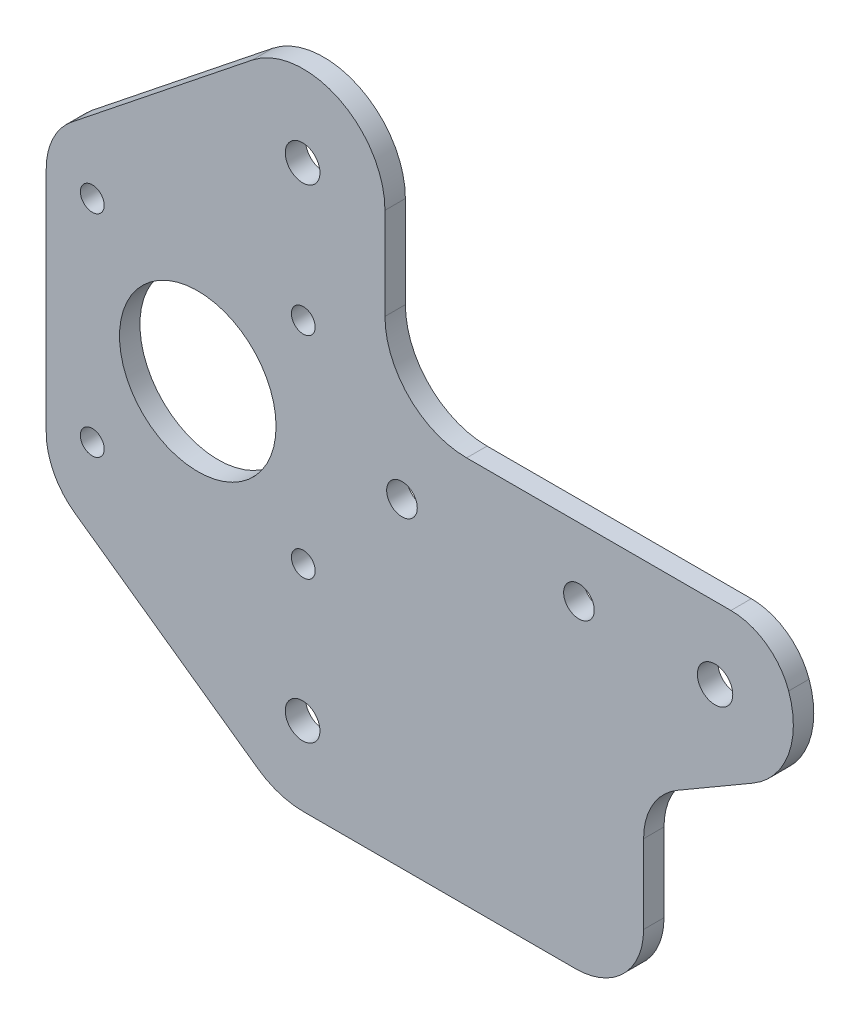
ISO-10303-21;
HEADER;
FILE_DESCRIPTION(('STEP AP214'),'2;1');
FILE_NAME('part.step','',(''),(''),'','','');
FILE_SCHEMA(('AUTOMOTIVE_DESIGN { 1 0 10303 214 1 1 1 1 }'));
ENDSEC;
DATA;
#1=APPLICATION_CONTEXT('core data for automotive mechanical design processes');
#2=APPLICATION_PROTOCOL_DEFINITION('international standard','automotive_design',2000,#1);
#3=PRODUCT_CONTEXT('',#1,'mechanical');
#4=PRODUCT('Part','Part','',(#3));
#5=PRODUCT_RELATED_PRODUCT_CATEGORY('part','',(#4));
#6=PRODUCT_DEFINITION_FORMATION('','',#4);
#7=PRODUCT_DEFINITION_CONTEXT('part definition',#1,'design');
#8=PRODUCT_DEFINITION('design','',#6,#7);
#9=PRODUCT_DEFINITION_SHAPE('','',#8);
#10=(LENGTH_UNIT() NAMED_UNIT(*) SI_UNIT(.MILLI.,.METRE.));
#11=(NAMED_UNIT(*) PLANE_ANGLE_UNIT() SI_UNIT($,.RADIAN.));
#12=(NAMED_UNIT(*) SI_UNIT($,.STERADIAN.) SOLID_ANGLE_UNIT());
#13=UNCERTAINTY_MEASURE_WITH_UNIT(LENGTH_MEASURE(1.E-05),#10,'distance_accuracy_value','');
#14=(GEOMETRIC_REPRESENTATION_CONTEXT(3) GLOBAL_UNCERTAINTY_ASSIGNED_CONTEXT((#13)) GLOBAL_UNIT_ASSIGNED_CONTEXT((#10,
#11,#12)) REPRESENTATION_CONTEXT('',''));
#15=CARTESIAN_POINT('',(0.,0.,0.));
#16=DIRECTION('',(0.,0.,1.));
#17=DIRECTION('',(1.,0.,0.));
#18=AXIS2_PLACEMENT_3D('',#15,#16,#17);
#19=CARTESIAN_POINT('',(78.328427124748,1.00000000000073,3.));
#20=DIRECTION('',(0.,0.,-1.));
#21=DIRECTION('',(-1.,0.,0.));
#22=AXIS2_PLACEMENT_3D('',#19,#20,#21);
#23=CYLINDRICAL_SURFACE('',#22,8.99999999999999);
#24=CARTESIAN_POINT('',(78.328427124748,1.00000000000073,0.));
#25=DIRECTION('',(0.,0.,-1.));
#26=DIRECTION('',(-1.,0.,0.));
#27=AXIS2_PLACEMENT_3D('',#24,#25,#26);
#28=CIRCLE('',#27,8.99999999999999);
#29=CARTESIAN_POINT('',(78.328427124748,10.0000000000007,0.));
#30=VERTEX_POINT('',#29);
#31=CARTESIAN_POINT('',(86.8137084989878,3.99999999999713,0.));
#32=VERTEX_POINT('',#31);
#33=EDGE_CURVE('E188',#30,#32,#28,.T.);
#34=ORIENTED_EDGE('',*,*,#33,.F.);
#35=DIRECTION('',(0.,0.,-1.));
#36=VECTOR('',#35,1.);
#37=CARTESIAN_POINT('',(78.328427124748,10.0000000000007,3.));
#38=LINE('',#37,#36);
#39=CARTESIAN_POINT('',(78.328427124748,10.0000000000007,3.));
#40=VERTEX_POINT('',#39);
#41=EDGE_CURVE('E11',#40,#30,#38,.T.);
#42=ORIENTED_EDGE('',*,*,#41,.F.);
#43=CARTESIAN_POINT('',(78.328427124748,1.00000000000073,3.));
#44=DIRECTION('',(0.,0.,-1.));
#45=DIRECTION('',(-1.,0.,0.));
#46=AXIS2_PLACEMENT_3D('',#43,#44,#45);
#47=CIRCLE('',#46,8.99999999999999);
#48=CARTESIAN_POINT('',(86.8137084989878,3.99999999999713,3.));
#49=VERTEX_POINT('',#48);
#50=EDGE_CURVE('E236',#40,#49,#47,.T.);
#51=ORIENTED_EDGE('',*,*,#50,.T.);
#52=DIRECTION('',(0.,0.,-1.));
#53=VECTOR('',#52,1.);
#54=CARTESIAN_POINT('',(86.8137084989878,3.99999999999713,3.));
#55=LINE('',#54,#53);
#56=EDGE_CURVE('E40',#49,#32,#55,.T.);
#57=ORIENTED_EDGE('',*,*,#56,.T.);
#58=EDGE_LOOP('',(#34,#42,#51,#57));
#59=FACE_BOUND('',#58,.T.);
#60=ADVANCED_FACE('F37',(#59),#23,.T.);
#61=CARTESIAN_POINT('',(39.499999999998,10.0000000000007,3.));
#62=DIRECTION('',(0.,1.,0.));
#63=DIRECTION('',(-1.,0.,0.));
#64=AXIS2_PLACEMENT_3D('',#61,#62,#63);
#65=PLANE('',#64);
#66=DIRECTION('',(1.,0.,0.));
#67=VECTOR('',#66,1.);
#68=CARTESIAN_POINT('',(39.499999999998,10.0000000000007,0.));
#69=LINE('',#68,#67);
#70=CARTESIAN_POINT('',(39.499999999998,10.0000000000007,0.));
#71=VERTEX_POINT('',#70);
#72=EDGE_CURVE('E234',#71,#30,#69,.T.);
#73=ORIENTED_EDGE('',*,*,#72,.F.);
#74=DIRECTION('',(0.,0.,-1.));
#75=VECTOR('',#74,1.);
#76=CARTESIAN_POINT('',(39.499999999998,10.0000000000007,3.));
#77=LINE('',#76,#75);
#78=CARTESIAN_POINT('',(39.499999999998,10.0000000000007,3.));
#79=VERTEX_POINT('',#78);
#80=EDGE_CURVE('E46',#79,#71,#77,.T.);
#81=ORIENTED_EDGE('',*,*,#80,.F.);
#82=DIRECTION('',(1.,0.,0.));
#83=VECTOR('',#82,1.);
#84=CARTESIAN_POINT('',(39.499999999998,10.0000000000007,3.));
#85=LINE('',#84,#83);
#86=EDGE_CURVE('E178',#79,#40,#85,.T.);
#87=ORIENTED_EDGE('',*,*,#86,.T.);
#88=ORIENTED_EDGE('',*,*,#41,.T.);
#89=EDGE_LOOP('',(#73,#81,#87,#88));
#90=FACE_BOUND('',#89,.T.);
#91=ADVANCED_FACE('F266',(#90),#65,.T.);
#92=CARTESIAN_POINT('',(39.499999999998,22.0000000000007,3.));
#93=DIRECTION('',(0.,0.,-1.));
#94=DIRECTION('',(-1.,0.,0.));
#95=AXIS2_PLACEMENT_3D('',#92,#93,#94);
#96=CYLINDRICAL_SURFACE('',#95,12.);
#97=CARTESIAN_POINT('',(39.499999999998,22.0000000000007,0.));
#98=DIRECTION('',(0.,0.,1.));
#99=DIRECTION('',(1.,0.,0.));
#100=AXIS2_PLACEMENT_3D('',#97,#98,#99);
#101=CIRCLE('',#100,12.);
#102=CARTESIAN_POINT('',(27.499999999998,22.0000000000007,0.));
#103=VERTEX_POINT('',#102);
#104=EDGE_CURVE('E165',#103,#71,#101,.T.);
#105=ORIENTED_EDGE('',*,*,#104,.F.);
#106=DIRECTION('',(0.,0.,-1.));
#107=VECTOR('',#106,1.);
#108=CARTESIAN_POINT('',(27.499999999998,22.0000000000007,3.));
#109=LINE('',#108,#107);
#110=CARTESIAN_POINT('',(27.499999999998,22.0000000000007,3.));
#111=VERTEX_POINT('',#110);
#112=EDGE_CURVE('E160',#111,#103,#109,.T.);
#113=ORIENTED_EDGE('',*,*,#112,.F.);
#114=CARTESIAN_POINT('',(39.499999999998,22.0000000000007,3.));
#115=DIRECTION('',(0.,0.,1.));
#116=DIRECTION('',(1.,0.,0.));
#117=AXIS2_PLACEMENT_3D('',#114,#115,#116);
#118=CIRCLE('',#117,12.);
#119=EDGE_CURVE('E163',#111,#79,#118,.T.);
#120=ORIENTED_EDGE('',*,*,#119,.T.);
#121=ORIENTED_EDGE('',*,*,#80,.T.);
#122=EDGE_LOOP('',(#105,#113,#120,#121));
#123=FACE_BOUND('',#122,.T.);
#124=ADVANCED_FACE('F162',(#123),#96,.F.);
#125=CARTESIAN_POINT('',(27.499999999998,35.5000000000007,3.));
#126=DIRECTION('',(1.,0.,0.));
#127=DIRECTION('',(0.,1.,0.));
#128=AXIS2_PLACEMENT_3D('',#125,#126,#127);
#129=PLANE('',#128);
#130=DIRECTION('',(0.,-1.,0.));
#131=VECTOR('',#130,1.);
#132=CARTESIAN_POINT('',(27.499999999998,35.5000000000007,0.));
#133=LINE('',#132,#131);
#134=CARTESIAN_POINT('',(27.4999999999991,35.5000000000007,0.));
#135=VERTEX_POINT('',#134);
#136=EDGE_CURVE('E231',#135,#103,#133,.T.);
#137=ORIENTED_EDGE('',*,*,#136,.F.);
#138=DIRECTION('',(0.,0.,-1.));
#139=VECTOR('',#138,1.);
#140=CARTESIAN_POINT('',(27.4999999999991,35.5000000000007,3.));
#141=LINE('',#140,#139);
#142=CARTESIAN_POINT('',(27.4999999999991,35.5000000000007,3.));
#143=VERTEX_POINT('',#142);
#144=EDGE_CURVE('E170',#143,#135,#141,.T.);
#145=ORIENTED_EDGE('',*,*,#144,.F.);
#146=DIRECTION('',(0.,-1.,0.));
#147=VECTOR('',#146,1.);
#148=CARTESIAN_POINT('',(27.499999999998,35.5000000000007,3.));
#149=LINE('',#148,#147);
#150=EDGE_CURVE('E176',#143,#111,#149,.T.);
#151=ORIENTED_EDGE('',*,*,#150,.T.);
#152=ORIENTED_EDGE('',*,*,#112,.T.);
#153=EDGE_LOOP('',(#137,#145,#151,#152));
#154=FACE_BOUND('',#153,.T.);
#155=ADVANCED_FACE('F180',(#154),#129,.T.);
#156=CARTESIAN_POINT('',(15.5,35.5,3.));
#157=DIRECTION('',(0.,0.,-1.));
#158=DIRECTION('',(-1.,0.,0.));
#159=AXIS2_PLACEMENT_3D('',#156,#157,#158);
#160=CYLINDRICAL_SURFACE('',#159,11.9999999999991);
#161=CARTESIAN_POINT('',(15.5,35.5,0.));
#162=DIRECTION('',(0.,0.,-1.));
#163=DIRECTION('',(-1.,0.,0.));
#164=AXIS2_PLACEMENT_3D('',#161,#162,#163);
#165=CIRCLE('',#164,11.9999999999991);
#166=CARTESIAN_POINT('',(8.01872401002504,44.8824575438329,0.));
#167=VERTEX_POINT('',#166);
#168=EDGE_CURVE('E228',#167,#135,#165,.T.);
#169=ORIENTED_EDGE('',*,*,#168,.F.);
#170=DIRECTION('',(0.,0.,-1.));
#171=VECTOR('',#170,1.);
#172=CARTESIAN_POINT('',(8.01872401002504,44.8824575438329,3.));
#173=LINE('',#172,#171);
#174=CARTESIAN_POINT('',(8.01872401002504,44.8824575438329,3.));
#175=VERTEX_POINT('',#174);
#176=EDGE_CURVE('E240',#175,#167,#173,.T.);
#177=ORIENTED_EDGE('',*,*,#176,.F.);
#178=CARTESIAN_POINT('',(15.5,35.5,3.));
#179=DIRECTION('',(0.,0.,-1.));
#180=DIRECTION('',(-1.,0.,0.));
#181=AXIS2_PLACEMENT_3D('',#178,#179,#180);
#182=CIRCLE('',#181,11.9999999999991);
#183=EDGE_CURVE('E181',#175,#143,#182,.T.);
#184=ORIENTED_EDGE('',*,*,#183,.T.);
#185=ORIENTED_EDGE('',*,*,#144,.T.);
#186=EDGE_LOOP('',(#169,#177,#184,#185));
#187=FACE_BOUND('',#186,.T.);
#188=ADVANCED_FACE('F279',(#187),#160,.T.);
#189=CARTESIAN_POINT('',(-18.4985911058042,23.7383860713174,3.));
#190=DIRECTION('',(-0.623439665831225,0.78187146198608,0.));
#191=DIRECTION('',(-0.78187146198608,-0.623439665831225,0.));
#192=AXIS2_PLACEMENT_3D('',#189,#190,#191);
#193=PLANE('',#192);
#194=DIRECTION('',(0.78187146198608,0.623439665831225,0.));
#195=VECTOR('',#194,1.);
#196=CARTESIAN_POINT('',(-18.4985911058042,23.7383860713174,0.));
#197=LINE('',#196,#195);
#198=CARTESIAN_POINT('',(-18.4985911058042,23.7383860713174,0.));
#199=VERTEX_POINT('',#198);
#200=EDGE_CURVE('E225',#199,#167,#197,.T.);
#201=ORIENTED_EDGE('',*,*,#200,.F.);
#202=DIRECTION('',(0.,0.,-1.));
#203=VECTOR('',#202,1.);
#204=CARTESIAN_POINT('',(-18.4985911058042,23.7383860713174,3.));
#205=LINE('',#204,#203);
#206=CARTESIAN_POINT('',(-18.4985911058042,23.7383860713174,3.));
#207=VERTEX_POINT('',#206);
#208=EDGE_CURVE('E242',#207,#199,#205,.T.);
#209=ORIENTED_EDGE('',*,*,#208,.F.);
#210=DIRECTION('',(0.78187146198608,0.623439665831225,0.));
#211=VECTOR('',#210,1.);
#212=CARTESIAN_POINT('',(-18.4985911058042,23.7383860713174,3.));
#213=LINE('',#212,#211);
#214=EDGE_CURVE('E183',#207,#175,#213,.T.);
#215=ORIENTED_EDGE('',*,*,#214,.T.);
#216=ORIENTED_EDGE('',*,*,#176,.T.);
#217=EDGE_LOOP('',(#201,#209,#215,#216));
#218=FACE_BOUND('',#217,.T.);
#219=ADVANCED_FACE('F282',(#218),#193,.T.);
#220=CARTESIAN_POINT('',(-12.2641944474931,15.919671451458,3.));
#221=DIRECTION('',(0.,0.,-1.));
#222=DIRECTION('',(-1.,0.,0.));
#223=AXIS2_PLACEMENT_3D('',#220,#221,#222);
#224=CYLINDRICAL_SURFACE('',#223,9.99999999999816);
#225=CARTESIAN_POINT('',(-12.2641944474931,15.919671451458,0.));
#226=DIRECTION('',(0.,0.,-1.));
#227=DIRECTION('',(-1.,0.,0.));
#228=AXIS2_PLACEMENT_3D('',#225,#226,#227);
#229=CIRCLE('',#228,9.99999999999816);
#230=CARTESIAN_POINT('',(-22.2641944474913,15.919671451458,0.));
#231=VERTEX_POINT('',#230);
#232=EDGE_CURVE('E222',#231,#199,#229,.T.);
#233=ORIENTED_EDGE('',*,*,#232,.F.);
#234=DIRECTION('',(0.,0.,-1.));
#235=VECTOR('',#234,1.);
#236=CARTESIAN_POINT('',(-22.2641944474913,15.919671451458,3.));
#237=LINE('',#236,#235);
#238=CARTESIAN_POINT('',(-22.2641944474913,15.919671451458,3.));
#239=VERTEX_POINT('',#238);
#240=EDGE_CURVE('E244',#239,#231,#237,.T.);
#241=ORIENTED_EDGE('',*,*,#240,.F.);
#242=CARTESIAN_POINT('',(-12.2641944474931,15.919671451458,3.));
#243=DIRECTION('',(0.,0.,-1.));
#244=DIRECTION('',(-1.,0.,0.));
#245=AXIS2_PLACEMENT_3D('',#242,#243,#244);
#246=CIRCLE('',#245,9.99999999999816);
#247=EDGE_CURVE('E471',#239,#207,#246,.T.);
#248=ORIENTED_EDGE('',*,*,#247,.T.);
#249=ORIENTED_EDGE('',*,*,#208,.T.);
#250=EDGE_LOOP('',(#233,#241,#248,#249));
#251=FACE_BOUND('',#250,.T.);
#252=ADVANCED_FACE('F286',(#251),#224,.T.);
#253=CARTESIAN_POINT('',(-22.2641944474913,-17.6526316864796,3.));
#254=DIRECTION('',(-1.,0.,0.));
#255=DIRECTION('',(0.,-1.,0.));
#256=AXIS2_PLACEMENT_3D('',#253,#254,#255);
#257=PLANE('',#256);
#258=DIRECTION('',(0.,1.,0.));
#259=VECTOR('',#258,1.);
#260=CARTESIAN_POINT('',(-22.2641944474913,-17.6526316864796,0.));
#261=LINE('',#260,#259);
#262=CARTESIAN_POINT('',(-22.2641944474912,-17.65263168648,0.));
#263=VERTEX_POINT('',#262);
#264=EDGE_CURVE('E219',#263,#231,#261,.T.);
#265=ORIENTED_EDGE('',*,*,#264,.F.);
#266=DIRECTION('',(0.,0.,-1.));
#267=VECTOR('',#266,1.);
#268=CARTESIAN_POINT('',(-22.2641944474912,-17.65263168648,3.));
#269=LINE('',#268,#267);
#270=CARTESIAN_POINT('',(-22.2641944474912,-17.65263168648,3.));
#271=VERTEX_POINT('',#270);
#272=EDGE_CURVE('E246',#271,#263,#269,.T.);
#273=ORIENTED_EDGE('',*,*,#272,.F.);
#274=DIRECTION('',(0.,1.,0.));
#275=VECTOR('',#274,1.);
#276=CARTESIAN_POINT('',(-22.2641944474913,-17.6526316864796,3.));
#277=LINE('',#276,#275);
#278=EDGE_CURVE('E468',#271,#239,#277,.T.);
#279=ORIENTED_EDGE('',*,*,#278,.T.);
#280=ORIENTED_EDGE('',*,*,#240,.T.);
#281=EDGE_LOOP('',(#265,#273,#279,#280));
#282=FACE_BOUND('',#281,.T.);
#283=ADVANCED_FACE('F290',(#282),#257,.T.);
#284=CARTESIAN_POINT('',(-12.26419444749,-17.65263168648,3.));
#285=DIRECTION('',(0.,0.,-1.));
#286=DIRECTION('',(-1.,0.,0.));
#287=AXIS2_PLACEMENT_3D('',#284,#285,#286);
#288=CYLINDRICAL_SURFACE('',#287,10.0000000000012);
#289=CARTESIAN_POINT('',(-12.26419444749,-17.65263168648,0.));
#290=DIRECTION('',(0.,0.,-1.));
#291=DIRECTION('',(-1.,0.,0.));
#292=AXIS2_PLACEMENT_3D('',#289,#290,#291);
#293=CIRCLE('',#292,10.0000000000012);
#294=CARTESIAN_POINT('',(-18.048253692012,-25.8101226399461,0.));
#295=VERTEX_POINT('',#294);
#296=EDGE_CURVE('E216',#295,#263,#293,.T.);
#297=ORIENTED_EDGE('',*,*,#296,.F.);
#298=DIRECTION('',(0.,0.,-1.));
#299=VECTOR('',#298,1.);
#300=CARTESIAN_POINT('',(-18.048253692012,-25.8101226399461,3.));
#301=LINE('',#300,#299);
#302=CARTESIAN_POINT('',(-18.048253692012,-25.8101226399461,3.));
#303=VERTEX_POINT('',#302);
#304=EDGE_CURVE('E248',#303,#295,#301,.T.);
#305=ORIENTED_EDGE('',*,*,#304,.F.);
#306=CARTESIAN_POINT('',(-12.26419444749,-17.65263168648,3.));
#307=DIRECTION('',(0.,0.,-1.));
#308=DIRECTION('',(-1.,0.,0.));
#309=AXIS2_PLACEMENT_3D('',#306,#307,#308);
#310=CIRCLE('',#309,10.0000000000012);
#311=EDGE_CURVE('E465',#303,#271,#310,.T.);
#312=ORIENTED_EDGE('',*,*,#311,.T.);
#313=ORIENTED_EDGE('',*,*,#272,.T.);
#314=EDGE_LOOP('',(#297,#305,#312,#313));
#315=FACE_BOUND('',#314,.T.);
#316=ADVANCED_FACE('F294',(#315),#288,.T.);
#317=CARTESIAN_POINT('',(8.84833186879981,-44.8811145964848,3.));
#318=DIRECTION('',(-0.578405924452134,-0.815749095346524,0.));
#319=DIRECTION('',(0.815749095346524,-0.578405924452134,0.));
#320=AXIS2_PLACEMENT_3D('',#317,#318,#319);
#321=PLANE('',#320);
#322=DIRECTION('',(-0.815749095346524,0.578405924452134,0.));
#323=VECTOR('',#322,1.);
#324=CARTESIAN_POINT('',(8.84833186879981,-44.8811145964848,0.));
#325=LINE('',#324,#323);
#326=CARTESIAN_POINT('',(8.84833186879987,-44.8811145964847,0.));
#327=VERTEX_POINT('',#326);
#328=EDGE_CURVE('E213',#327,#295,#325,.T.);
#329=ORIENTED_EDGE('',*,*,#328,.F.);
#330=DIRECTION('',(0.,0.,-1.));
#331=VECTOR('',#330,1.);
#332=CARTESIAN_POINT('',(8.84833186879987,-44.8811145964847,3.));
#333=LINE('',#332,#331);
#334=CARTESIAN_POINT('',(8.84833186879987,-44.8811145964847,3.));
#335=VERTEX_POINT('',#334);
#336=EDGE_CURVE('E250',#335,#327,#333,.T.);
#337=ORIENTED_EDGE('',*,*,#336,.F.);
#338=DIRECTION('',(-0.815749095346524,0.578405924452134,0.));
#339=VECTOR('',#338,1.);
#340=CARTESIAN_POINT('',(8.84833186879981,-44.8811145964848,3.));
#341=LINE('',#340,#339);
#342=EDGE_CURVE('E462',#335,#303,#341,.T.);
#343=ORIENTED_EDGE('',*,*,#342,.T.);
#344=ORIENTED_EDGE('',*,*,#304,.T.);
#345=EDGE_LOOP('',(#329,#337,#343,#344));
#346=FACE_BOUND('',#345,.T.);
#347=ADVANCED_FACE('F298',(#346),#321,.T.);
#348=CARTESIAN_POINT('',(15.5,-35.5,3.));
#349=DIRECTION('',(0.,0.,-1.));
#350=DIRECTION('',(-1.,0.,0.));
#351=AXIS2_PLACEMENT_3D('',#348,#349,#350);
#352=CYLINDRICAL_SURFACE('',#351,11.5000000000001);
#353=CARTESIAN_POINT('',(15.5,-35.5,0.));
#354=DIRECTION('',(0.,0.,-1.));
#355=DIRECTION('',(-1.,0.,0.));
#356=AXIS2_PLACEMENT_3D('',#353,#354,#355);
#357=CIRCLE('',#356,11.5000000000001);
#358=CARTESIAN_POINT('',(15.5,-47.,0.));
#359=VERTEX_POINT('',#358);
#360=EDGE_CURVE('E210',#359,#327,#357,.T.);
#361=ORIENTED_EDGE('',*,*,#360,.F.);
#362=DIRECTION('',(0.,0.,-1.));
#363=VECTOR('',#362,1.);
#364=CARTESIAN_POINT('',(15.5,-47.,3.));
#365=LINE('',#364,#363);
#366=CARTESIAN_POINT('',(15.5,-47.,3.));
#367=VERTEX_POINT('',#366);
#368=EDGE_CURVE('E252',#367,#359,#365,.T.);
#369=ORIENTED_EDGE('',*,*,#368,.F.);
#370=CARTESIAN_POINT('',(15.5,-35.5,3.));
#371=DIRECTION('',(0.,0.,-1.));
#372=DIRECTION('',(-1.,0.,0.));
#373=AXIS2_PLACEMENT_3D('',#370,#371,#372);
#374=CIRCLE('',#373,11.5000000000001);
#375=EDGE_CURVE('E459',#367,#335,#374,.T.);
#376=ORIENTED_EDGE('',*,*,#375,.T.);
#377=ORIENTED_EDGE('',*,*,#336,.T.);
#378=EDGE_LOOP('',(#361,#369,#376,#377));
#379=FACE_BOUND('',#378,.T.);
#380=ADVANCED_FACE('F302',(#379),#352,.T.);
#381=CARTESIAN_POINT('',(55.5,-47.,3.));
#382=DIRECTION('',(0.,-1.,0.));
#383=DIRECTION('',(0.,0.,-1.));
#384=AXIS2_PLACEMENT_3D('',#381,#382,#383);
#385=PLANE('',#384);
#386=DIRECTION('',(-1.,0.,0.));
#387=VECTOR('',#386,1.);
#388=CARTESIAN_POINT('',(55.5,-47.,0.));
#389=LINE('',#388,#387);
#390=CARTESIAN_POINT('',(55.5,-47.,0.));
#391=VERTEX_POINT('',#390);
#392=EDGE_CURVE('E207',#391,#359,#389,.T.);
#393=ORIENTED_EDGE('',*,*,#392,.F.);
#394=DIRECTION('',(0.,0.,-1.));
#395=VECTOR('',#394,1.);
#396=CARTESIAN_POINT('',(55.5,-47.,3.));
#397=LINE('',#396,#395);
#398=CARTESIAN_POINT('',(55.5,-47.,3.));
#399=VERTEX_POINT('',#398);
#400=EDGE_CURVE('E254',#399,#391,#397,.T.);
#401=ORIENTED_EDGE('',*,*,#400,.F.);
#402=DIRECTION('',(-1.,0.,0.));
#403=VECTOR('',#402,1.);
#404=CARTESIAN_POINT('',(55.5,-47.,3.));
#405=LINE('',#404,#403);
#406=EDGE_CURVE('E456',#399,#367,#405,.T.);
#407=ORIENTED_EDGE('',*,*,#406,.T.);
#408=ORIENTED_EDGE('',*,*,#368,.T.);
#409=EDGE_LOOP('',(#393,#401,#407,#408));
#410=FACE_BOUND('',#409,.T.);
#411=ADVANCED_FACE('F306',(#410),#385,.T.);
#412=CARTESIAN_POINT('',(55.5,-37.,3.));
#413=DIRECTION('',(0.,0.,-1.));
#414=DIRECTION('',(-1.,0.,0.));
#415=AXIS2_PLACEMENT_3D('',#412,#413,#414);
#416=CYLINDRICAL_SURFACE('',#415,10.);
#417=CARTESIAN_POINT('',(55.5,-37.,0.));
#418=DIRECTION('',(0.,0.,-1.));
#419=DIRECTION('',(-1.,0.,0.));
#420=AXIS2_PLACEMENT_3D('',#417,#418,#419);
#421=CIRCLE('',#420,10.);
#422=CARTESIAN_POINT('',(65.5,-37.,0.));
#423=VERTEX_POINT('',#422);
#424=EDGE_CURVE('E204',#423,#391,#421,.T.);
#425=ORIENTED_EDGE('',*,*,#424,.F.);
#426=DIRECTION('',(0.,0.,-1.));
#427=VECTOR('',#426,1.);
#428=CARTESIAN_POINT('',(65.5,-37.,3.));
#429=LINE('',#428,#427);
#430=CARTESIAN_POINT('',(65.5,-37.,3.));
#431=VERTEX_POINT('',#430);
#432=EDGE_CURVE('E256',#431,#423,#429,.T.);
#433=ORIENTED_EDGE('',*,*,#432,.F.);
#434=CARTESIAN_POINT('',(55.5,-37.,3.));
#435=DIRECTION('',(0.,0.,-1.));
#436=DIRECTION('',(-1.,0.,0.));
#437=AXIS2_PLACEMENT_3D('',#434,#435,#436);
#438=CIRCLE('',#437,10.);
#439=EDGE_CURVE('E453',#431,#399,#438,.T.);
#440=ORIENTED_EDGE('',*,*,#439,.T.);
#441=ORIENTED_EDGE('',*,*,#400,.T.);
#442=EDGE_LOOP('',(#425,#433,#440,#441));
#443=FACE_BOUND('',#442,.T.);
#444=ADVANCED_FACE('F310',(#443),#416,.T.);
#445=CARTESIAN_POINT('',(65.5,-25.45498557008,3.));
#446=DIRECTION('',(1.,0.,0.));
#447=DIRECTION('',(0.,0.,-1.));
#448=AXIS2_PLACEMENT_3D('',#445,#446,#447);
#449=PLANE('',#448);
#450=DIRECTION('',(0.,-1.,0.));
#451=VECTOR('',#450,1.);
#452=CARTESIAN_POINT('',(65.5,-25.45498557008,0.));
#453=LINE('',#452,#451);
#454=CARTESIAN_POINT('',(65.4999999999996,-25.45498557008,0.));
#455=VERTEX_POINT('',#454);
#456=EDGE_CURVE('E201',#455,#423,#453,.T.);
#457=ORIENTED_EDGE('',*,*,#456,.F.);
#458=DIRECTION('',(0.,0.,-1.));
#459=VECTOR('',#458,1.);
#460=CARTESIAN_POINT('',(65.4999999999996,-25.45498557008,3.));
#461=LINE('',#460,#459);
#462=CARTESIAN_POINT('',(65.4999999999996,-25.45498557008,3.));
#463=VERTEX_POINT('',#462);
#464=EDGE_CURVE('E258',#463,#455,#461,.T.);
#465=ORIENTED_EDGE('',*,*,#464,.F.);
#466=DIRECTION('',(0.,-1.,0.));
#467=VECTOR('',#466,1.);
#468=CARTESIAN_POINT('',(65.5,-25.45498557008,3.));
#469=LINE('',#468,#467);
#470=EDGE_CURVE('E450',#463,#431,#469,.T.);
#471=ORIENTED_EDGE('',*,*,#470,.T.);
#472=ORIENTED_EDGE('',*,*,#432,.T.);
#473=EDGE_LOOP('',(#457,#465,#471,#472));
#474=FACE_BOUND('',#473,.T.);
#475=ADVANCED_FACE('F314',(#474),#449,.T.);
#476=CARTESIAN_POINT('',(75.5,-25.45498557008,3.));
#477=DIRECTION('',(0.,0.,-1.));
#478=DIRECTION('',(-1.,0.,0.));
#479=AXIS2_PLACEMENT_3D('',#476,#477,#478);
#480=CYLINDRICAL_SURFACE('',#479,10.0000000000004);
#481=CARTESIAN_POINT('',(75.5,-25.45498557008,0.));
#482=DIRECTION('',(0.,0.,1.));
#483=DIRECTION('',(1.,0.,0.));
#484=AXIS2_PLACEMENT_3D('',#481,#482,#483);
#485=CIRCLE('',#484,10.0000000000004);
#486=CARTESIAN_POINT('',(70.4697312726161,-16.8122778618257,0.));
#487=VERTEX_POINT('',#486);
#488=EDGE_CURVE('E198',#487,#455,#485,.T.);
#489=ORIENTED_EDGE('',*,*,#488,.F.);
#490=DIRECTION('',(0.,0.,-1.));
#491=VECTOR('',#490,1.);
#492=CARTESIAN_POINT('',(70.4697312726161,-16.8122778618257,3.));
#493=LINE('',#492,#491);
#494=CARTESIAN_POINT('',(70.4697312726161,-16.8122778618257,3.));
#495=VERTEX_POINT('',#494);
#496=EDGE_CURVE('E260',#495,#487,#493,.T.);
#497=ORIENTED_EDGE('',*,*,#496,.F.);
#498=CARTESIAN_POINT('',(75.5,-25.45498557008,3.));
#499=DIRECTION('',(0.,0.,1.));
#500=DIRECTION('',(1.,0.,0.));
#501=AXIS2_PLACEMENT_3D('',#498,#499,#500);
#502=CIRCLE('',#501,10.0000000000004);
#503=EDGE_CURVE('E447',#495,#463,#502,.T.);
#504=ORIENTED_EDGE('',*,*,#503,.T.);
#505=ORIENTED_EDGE('',*,*,#464,.T.);
#506=EDGE_LOOP('',(#489,#497,#504,#505));
#507=FACE_BOUND('',#506,.T.);
#508=ADVANCED_FACE('F318',(#507),#480,.F.);
#509=CARTESIAN_POINT('',(81.5363224728607,-10.3712492499051,3.));
#510=DIRECTION('',(0.503026872738356,-0.864270770825365,0.));
#511=DIRECTION('',(0.864270770825365,0.503026872738356,0.));
#512=AXIS2_PLACEMENT_3D('',#509,#510,#511);
#513=PLANE('',#512);
#514=DIRECTION('',(-0.864270770825365,-0.503026872738356,0.));
#515=VECTOR('',#514,1.);
#516=CARTESIAN_POINT('',(81.5363224728607,-10.3712492499051,0.));
#517=LINE('',#516,#515);
#518=CARTESIAN_POINT('',(81.5363224728607,-10.3712492499051,0.));
#519=VERTEX_POINT('',#518);
#520=EDGE_CURVE('E195',#519,#487,#517,.T.);
#521=ORIENTED_EDGE('',*,*,#520,.F.);
#522=DIRECTION('',(0.,0.,-1.));
#523=VECTOR('',#522,1.);
#524=CARTESIAN_POINT('',(81.5363224728607,-10.3712492499051,3.));
#525=LINE('',#524,#523);
#526=CARTESIAN_POINT('',(81.5363224728607,-10.3712492499051,3.));
#527=VERTEX_POINT('',#526);
#528=EDGE_CURVE('E261',#527,#519,#525,.T.);
#529=ORIENTED_EDGE('',*,*,#528,.F.);
#530=DIRECTION('',(-0.864270770825365,-0.503026872738356,0.));
#531=VECTOR('',#530,1.);
#532=CARTESIAN_POINT('',(81.5363224728607,-10.3712492499051,3.));
#533=LINE('',#532,#531);
#534=EDGE_CURVE('E444',#527,#495,#533,.T.);
#535=ORIENTED_EDGE('',*,*,#534,.T.);
#536=ORIENTED_EDGE('',*,*,#496,.T.);
#537=EDGE_LOOP('',(#521,#529,#535,#536));
#538=FACE_BOUND('',#537,.T.);
#539=ADVANCED_FACE('F322',(#538),#513,.T.);
#540=CARTESIAN_POINT('',(75.4999999999993,1.18892174103081E-12,3.));
#541=DIRECTION('',(0.,0.,-1.));
#542=DIRECTION('',(-1.,0.,0.));
#543=AXIS2_PLACEMENT_3D('',#540,#541,#542);
#544=CYLINDRICAL_SURFACE('',#543,12.0000000000022);
#545=CARTESIAN_POINT('',(75.4999999999993,1.18892174103081E-12,0.));
#546=DIRECTION('',(0.,0.,-1.));
#547=DIRECTION('',(-1.,0.,0.));
#548=AXIS2_PLACEMENT_3D('',#545,#546,#547);
#549=CIRCLE('',#548,12.0000000000022);
#550=EDGE_CURVE('E191',#32,#519,#549,.T.);
#551=ORIENTED_EDGE('',*,*,#550,.F.);
#552=ORIENTED_EDGE('',*,*,#56,.F.);
#553=CARTESIAN_POINT('',(75.4999999999993,1.18892174103081E-12,3.));
#554=DIRECTION('',(0.,0.,-1.));
#555=DIRECTION('',(-1.,0.,0.));
#556=AXIS2_PLACEMENT_3D('',#553,#554,#555);
#557=CIRCLE('',#556,12.0000000000022);
#558=EDGE_CURVE('E442',#49,#527,#557,.T.);
#559=ORIENTED_EDGE('',*,*,#558,.T.);
#560=ORIENTED_EDGE('',*,*,#528,.T.);
#561=EDGE_LOOP('',(#551,#552,#559,#560));
#562=FACE_BOUND('',#561,.T.);
#563=ADVANCED_FACE('F263',(#562),#544,.T.);
#564=CARTESIAN_POINT('',(78.328427124748,1.00000000000073,3.));
#565=DIRECTION('',(0.,0.,-1.));
#566=DIRECTION('',(-1.,0.,0.));
#567=AXIS2_PLACEMENT_3D('',#564,#565,#566);
#568=PLANE('',#567);
#569=CARTESIAN_POINT('',(76.,-0.574456264653834,3.));
#570=DIRECTION('',(0.,0.,-1.));
#571=DIRECTION('',(1.,0.,0.));
#572=AXIS2_PLACEMENT_3D('',#569,#570,#571);
#573=CIRCLE('',#572,2.6);
#574=CARTESIAN_POINT('',(78.6,-0.574456264653834,3.));
#575=VERTEX_POINT('',#574);
#576=EDGE_CURVE('E381',#575,#575,#573,.T.);
#577=ORIENTED_EDGE('',*,*,#576,.T.);
#578=EDGE_LOOP('',(#577));
#579=FACE_BOUND('',#578,.T.);
#580=CARTESIAN_POINT('',(56.,0.,3.));
#581=DIRECTION('',(0.,0.,-1.));
#582=DIRECTION('',(1.,0.,0.));
#583=AXIS2_PLACEMENT_3D('',#580,#581,#582);
#584=CIRCLE('',#583,2.25);
#585=CARTESIAN_POINT('',(58.25,0.,3.));
#586=VERTEX_POINT('',#585);
#587=EDGE_CURVE('E389',#586,#586,#584,.T.);
#588=ORIENTED_EDGE('',*,*,#587,.T.);
#589=EDGE_LOOP('',(#588));
#590=FACE_BOUND('',#589,.T.);
#591=CARTESIAN_POINT('',(0.,0.,3.));
#592=DIRECTION('',(0.,0.,-1.));
#593=DIRECTION('',(1.,0.,0.));
#594=AXIS2_PLACEMENT_3D('',#591,#592,#593);
#595=CIRCLE('',#594,11.5);
#596=CARTESIAN_POINT('',(11.5,0.,3.));
#597=VERTEX_POINT('',#596);
#598=EDGE_CURVE('E395',#597,#597,#595,.T.);
#599=ORIENTED_EDGE('',*,*,#598,.T.);
#600=EDGE_LOOP('',(#599));
#601=FACE_BOUND('',#600,.T.);
#602=CARTESIAN_POINT('',(15.5,15.5,3.));
#603=DIRECTION('',(0.,0.,-1.));
#604=DIRECTION('',(1.,0.,0.));
#605=AXIS2_PLACEMENT_3D('',#602,#603,#604);
#606=CIRCLE('',#605,1.75);
#607=CARTESIAN_POINT('',(17.25,15.5,3.));
#608=VERTEX_POINT('',#607);
#609=EDGE_CURVE('E401',#608,#608,#606,.T.);
#610=ORIENTED_EDGE('',*,*,#609,.T.);
#611=EDGE_LOOP('',(#610));
#612=FACE_BOUND('',#611,.T.);
#613=CARTESIAN_POINT('',(15.5,-15.5,3.));
#614=DIRECTION('',(0.,0.,-1.));
#615=DIRECTION('',(1.,0.,0.));
#616=AXIS2_PLACEMENT_3D('',#613,#614,#615);
#617=CIRCLE('',#616,1.75);
#618=CARTESIAN_POINT('',(17.25,-15.5,3.));
#619=VERTEX_POINT('',#618);
#620=EDGE_CURVE('E407',#619,#619,#617,.T.);
#621=ORIENTED_EDGE('',*,*,#620,.T.);
#622=EDGE_LOOP('',(#621));
#623=FACE_BOUND('',#622,.T.);
#624=CARTESIAN_POINT('',(-15.5,-15.5,3.));
#625=DIRECTION('',(0.,0.,-1.));
#626=DIRECTION('',(1.,0.,0.));
#627=AXIS2_PLACEMENT_3D('',#624,#625,#626);
#628=CIRCLE('',#627,1.75);
#629=CARTESIAN_POINT('',(-13.75,-15.5,3.));
#630=VERTEX_POINT('',#629);
#631=EDGE_CURVE('E413',#630,#630,#628,.T.);
#632=ORIENTED_EDGE('',*,*,#631,.T.);
#633=EDGE_LOOP('',(#632));
#634=FACE_BOUND('',#633,.T.);
#635=CARTESIAN_POINT('',(-15.5,15.5,3.));
#636=DIRECTION('',(0.,0.,-1.));
#637=DIRECTION('',(1.,0.,0.));
#638=AXIS2_PLACEMENT_3D('',#635,#636,#637);
#639=CIRCLE('',#638,1.75);
#640=CARTESIAN_POINT('',(-13.75,15.5,3.));
#641=VERTEX_POINT('',#640);
#642=EDGE_CURVE('E419',#641,#641,#639,.T.);
#643=ORIENTED_EDGE('',*,*,#642,.T.);
#644=EDGE_LOOP('',(#643));
#645=FACE_BOUND('',#644,.T.);
#646=CARTESIAN_POINT('',(15.4,35.5,3.));
#647=DIRECTION('',(0.,0.,-1.));
#648=DIRECTION('',(1.,0.,0.));
#649=AXIS2_PLACEMENT_3D('',#646,#647,#648);
#650=CIRCLE('',#649,2.55);
#651=CARTESIAN_POINT('',(17.95,35.5,3.));
#652=VERTEX_POINT('',#651);
#653=EDGE_CURVE('E425',#652,#652,#650,.T.);
#654=ORIENTED_EDGE('',*,*,#653,.T.);
#655=EDGE_LOOP('',(#654));
#656=FACE_BOUND('',#655,.T.);
#657=CARTESIAN_POINT('',(15.4,-35.5,3.));
#658=DIRECTION('',(0.,0.,-1.));
#659=DIRECTION('',(1.,0.,0.));
#660=AXIS2_PLACEMENT_3D('',#657,#658,#659);
#661=CIRCLE('',#660,2.55);
#662=CARTESIAN_POINT('',(17.95,-35.5,3.));
#663=VERTEX_POINT('',#662);
#664=EDGE_CURVE('E431',#663,#663,#661,.T.);
#665=ORIENTED_EDGE('',*,*,#664,.T.);
#666=EDGE_LOOP('',(#665));
#667=FACE_BOUND('',#666,.T.);
#668=CARTESIAN_POINT('',(30.,0.,3.));
#669=DIRECTION('',(0.,0.,-1.));
#670=DIRECTION('',(1.,0.,0.));
#671=AXIS2_PLACEMENT_3D('',#668,#669,#670);
#672=CIRCLE('',#671,2.25);
#673=CARTESIAN_POINT('',(32.25,0.,3.));
#674=VERTEX_POINT('',#673);
#675=EDGE_CURVE('E192',#674,#674,#672,.T.);
#676=ORIENTED_EDGE('',*,*,#675,.T.);
#677=EDGE_LOOP('',(#676));
#678=FACE_BOUND('',#677,.T.);
#679=ORIENTED_EDGE('',*,*,#50,.F.);
#680=ORIENTED_EDGE('',*,*,#86,.F.);
#681=ORIENTED_EDGE('',*,*,#119,.F.);
#682=ORIENTED_EDGE('',*,*,#150,.F.);
#683=ORIENTED_EDGE('',*,*,#183,.F.);
#684=ORIENTED_EDGE('',*,*,#214,.F.);
#685=ORIENTED_EDGE('',*,*,#247,.F.);
#686=ORIENTED_EDGE('',*,*,#278,.F.);
#687=ORIENTED_EDGE('',*,*,#311,.F.);
#688=ORIENTED_EDGE('',*,*,#342,.F.);
#689=ORIENTED_EDGE('',*,*,#375,.F.);
#690=ORIENTED_EDGE('',*,*,#406,.F.);
#691=ORIENTED_EDGE('',*,*,#439,.F.);
#692=ORIENTED_EDGE('',*,*,#470,.F.);
#693=ORIENTED_EDGE('',*,*,#503,.F.);
#694=ORIENTED_EDGE('',*,*,#534,.F.);
#695=ORIENTED_EDGE('',*,*,#558,.F.);
#696=EDGE_LOOP('',(#679,#680,#681,#682,#683,#684,#685,#686,#687,#688,#689,#690,#691,#692,#693,
#694,#695));
#697=FACE_BOUND('',#696,.T.);
#698=ADVANCED_FACE('F174',(#579,#590,#601,#612,#623,#634,#645,#656,#667,#678,#697),#568,.F.);
#699=CARTESIAN_POINT('',(78.328427124748,1.00000000000073,0.));
#700=DIRECTION('',(0.,0.,-1.));
#701=DIRECTION('',(-1.,0.,0.));
#702=AXIS2_PLACEMENT_3D('',#699,#700,#701);
#703=PLANE('',#702);
#704=CARTESIAN_POINT('',(76.,-0.574456264653834,0.));
#705=DIRECTION('',(0.,0.,-1.));
#706=DIRECTION('',(1.,0.,0.));
#707=AXIS2_PLACEMENT_3D('',#704,#705,#706);
#708=CIRCLE('',#707,2.6);
#709=CARTESIAN_POINT('',(78.6,-0.574456264653834,0.));
#710=VERTEX_POINT('',#709);
#711=EDGE_CURVE('E384',#710,#710,#708,.T.);
#712=ORIENTED_EDGE('',*,*,#711,.F.);
#713=EDGE_LOOP('',(#712));
#714=FACE_BOUND('',#713,.T.);
#715=CARTESIAN_POINT('',(56.,0.,0.));
#716=DIRECTION('',(0.,0.,-1.));
#717=DIRECTION('',(1.,0.,0.));
#718=AXIS2_PLACEMENT_3D('',#715,#716,#717);
#719=CIRCLE('',#718,2.25);
#720=CARTESIAN_POINT('',(58.25,0.,0.));
#721=VERTEX_POINT('',#720);
#722=EDGE_CURVE('E386',#721,#721,#719,.T.);
#723=ORIENTED_EDGE('',*,*,#722,.F.);
#724=EDGE_LOOP('',(#723));
#725=FACE_BOUND('',#724,.T.);
#726=CARTESIAN_POINT('',(0.,0.,0.));
#727=DIRECTION('',(0.,0.,-1.));
#728=DIRECTION('',(1.,0.,0.));
#729=AXIS2_PLACEMENT_3D('',#726,#727,#728);
#730=CIRCLE('',#729,11.5);
#731=CARTESIAN_POINT('',(11.5,0.,0.));
#732=VERTEX_POINT('',#731);
#733=EDGE_CURVE('E392',#732,#732,#730,.T.);
#734=ORIENTED_EDGE('',*,*,#733,.F.);
#735=EDGE_LOOP('',(#734));
#736=FACE_BOUND('',#735,.T.);
#737=CARTESIAN_POINT('',(15.5,15.5,0.));
#738=DIRECTION('',(0.,0.,-1.));
#739=DIRECTION('',(1.,0.,0.));
#740=AXIS2_PLACEMENT_3D('',#737,#738,#739);
#741=CIRCLE('',#740,1.75);
#742=CARTESIAN_POINT('',(17.25,15.5,0.));
#743=VERTEX_POINT('',#742);
#744=EDGE_CURVE('E398',#743,#743,#741,.T.);
#745=ORIENTED_EDGE('',*,*,#744,.F.);
#746=EDGE_LOOP('',(#745));
#747=FACE_BOUND('',#746,.T.);
#748=CARTESIAN_POINT('',(15.5,-15.5,0.));
#749=DIRECTION('',(0.,0.,-1.));
#750=DIRECTION('',(1.,0.,0.));
#751=AXIS2_PLACEMENT_3D('',#748,#749,#750);
#752=CIRCLE('',#751,1.75);
#753=CARTESIAN_POINT('',(17.25,-15.5,0.));
#754=VERTEX_POINT('',#753);
#755=EDGE_CURVE('E404',#754,#754,#752,.T.);
#756=ORIENTED_EDGE('',*,*,#755,.F.);
#757=EDGE_LOOP('',(#756));
#758=FACE_BOUND('',#757,.T.);
#759=CARTESIAN_POINT('',(-15.5,-15.5,0.));
#760=DIRECTION('',(0.,0.,-1.));
#761=DIRECTION('',(1.,0.,0.));
#762=AXIS2_PLACEMENT_3D('',#759,#760,#761);
#763=CIRCLE('',#762,1.75);
#764=CARTESIAN_POINT('',(-13.75,-15.5,0.));
#765=VERTEX_POINT('',#764);
#766=EDGE_CURVE('E410',#765,#765,#763,.T.);
#767=ORIENTED_EDGE('',*,*,#766,.F.);
#768=EDGE_LOOP('',(#767));
#769=FACE_BOUND('',#768,.T.);
#770=CARTESIAN_POINT('',(-15.5,15.5,0.));
#771=DIRECTION('',(0.,0.,-1.));
#772=DIRECTION('',(1.,0.,0.));
#773=AXIS2_PLACEMENT_3D('',#770,#771,#772);
#774=CIRCLE('',#773,1.75);
#775=CARTESIAN_POINT('',(-13.75,15.5,0.));
#776=VERTEX_POINT('',#775);
#777=EDGE_CURVE('E416',#776,#776,#774,.T.);
#778=ORIENTED_EDGE('',*,*,#777,.F.);
#779=EDGE_LOOP('',(#778));
#780=FACE_BOUND('',#779,.T.);
#781=CARTESIAN_POINT('',(15.4,35.5,0.));
#782=DIRECTION('',(0.,0.,-1.));
#783=DIRECTION('',(1.,0.,0.));
#784=AXIS2_PLACEMENT_3D('',#781,#782,#783);
#785=CIRCLE('',#784,2.55);
#786=CARTESIAN_POINT('',(17.95,35.5,0.));
#787=VERTEX_POINT('',#786);
#788=EDGE_CURVE('E422',#787,#787,#785,.T.);
#789=ORIENTED_EDGE('',*,*,#788,.F.);
#790=EDGE_LOOP('',(#789));
#791=FACE_BOUND('',#790,.T.);
#792=CARTESIAN_POINT('',(15.4,-35.5,0.));
#793=DIRECTION('',(0.,0.,-1.));
#794=DIRECTION('',(1.,0.,0.));
#795=AXIS2_PLACEMENT_3D('',#792,#793,#794);
#796=CIRCLE('',#795,2.55);
#797=CARTESIAN_POINT('',(17.95,-35.5,0.));
#798=VERTEX_POINT('',#797);
#799=EDGE_CURVE('E428',#798,#798,#796,.T.);
#800=ORIENTED_EDGE('',*,*,#799,.F.);
#801=EDGE_LOOP('',(#800));
#802=FACE_BOUND('',#801,.T.);
#803=CARTESIAN_POINT('',(30.,0.,0.));
#804=DIRECTION('',(0.,0.,-1.));
#805=DIRECTION('',(1.,0.,0.));
#806=AXIS2_PLACEMENT_3D('',#803,#804,#805);
#807=CIRCLE('',#806,2.25);
#808=CARTESIAN_POINT('',(32.25,0.,0.));
#809=VERTEX_POINT('',#808);
#810=EDGE_CURVE('E434',#809,#809,#807,.T.);
#811=ORIENTED_EDGE('',*,*,#810,.F.);
#812=EDGE_LOOP('',(#811));
#813=FACE_BOUND('',#812,.T.);
#814=ORIENTED_EDGE('',*,*,#33,.T.);
#815=ORIENTED_EDGE('',*,*,#550,.T.);
#816=ORIENTED_EDGE('',*,*,#520,.T.);
#817=ORIENTED_EDGE('',*,*,#488,.T.);
#818=ORIENTED_EDGE('',*,*,#456,.T.);
#819=ORIENTED_EDGE('',*,*,#424,.T.);
#820=ORIENTED_EDGE('',*,*,#392,.T.);
#821=ORIENTED_EDGE('',*,*,#360,.T.);
#822=ORIENTED_EDGE('',*,*,#328,.T.);
#823=ORIENTED_EDGE('',*,*,#296,.T.);
#824=ORIENTED_EDGE('',*,*,#264,.T.);
#825=ORIENTED_EDGE('',*,*,#232,.T.);
#826=ORIENTED_EDGE('',*,*,#200,.T.);
#827=ORIENTED_EDGE('',*,*,#168,.T.);
#828=ORIENTED_EDGE('',*,*,#136,.T.);
#829=ORIENTED_EDGE('',*,*,#104,.T.);
#830=ORIENTED_EDGE('',*,*,#72,.T.);
#831=EDGE_LOOP('',(#814,#815,#816,#817,#818,#819,#820,#821,#822,#823,#824,#825,#826,#827,#828,
#829,#830));
#832=FACE_BOUND('',#831,.T.);
#833=ADVANCED_FACE('F265',(#714,#725,#736,#747,#758,#769,#780,#791,#802,#813,#832),#703,.T.);
#834=CARTESIAN_POINT('',(30.,0.,3.));
#835=DIRECTION('',(0.,0.,-1.));
#836=DIRECTION('',(-1.,0.,0.));
#837=AXIS2_PLACEMENT_3D('',#834,#835,#836);
#838=CYLINDRICAL_SURFACE('',#837,2.25);
#839=ORIENTED_EDGE('',*,*,#675,.F.);
#840=EDGE_LOOP('',(#839));
#841=FACE_BOUND('',#840,.T.);
#842=ORIENTED_EDGE('',*,*,#810,.T.);
#843=EDGE_LOOP('',(#842));
#844=FACE_BOUND('',#843,.T.);
#845=ADVANCED_FACE('F334',(#841,#844),#838,.F.);
#846=CARTESIAN_POINT('',(15.4,-35.5,3.));
#847=DIRECTION('',(0.,0.,-1.));
#848=DIRECTION('',(-1.,0.,0.));
#849=AXIS2_PLACEMENT_3D('',#846,#847,#848);
#850=CYLINDRICAL_SURFACE('',#849,2.55);
#851=ORIENTED_EDGE('',*,*,#664,.F.);
#852=EDGE_LOOP('',(#851));
#853=FACE_BOUND('',#852,.T.);
#854=ORIENTED_EDGE('',*,*,#799,.T.);
#855=EDGE_LOOP('',(#854));
#856=FACE_BOUND('',#855,.T.);
#857=ADVANCED_FACE('F341',(#853,#856),#850,.F.);
#858=CARTESIAN_POINT('',(15.4,35.5,3.));
#859=DIRECTION('',(0.,0.,-1.));
#860=DIRECTION('',(-1.,0.,0.));
#861=AXIS2_PLACEMENT_3D('',#858,#859,#860);
#862=CYLINDRICAL_SURFACE('',#861,2.55);
#863=ORIENTED_EDGE('',*,*,#653,.F.);
#864=EDGE_LOOP('',(#863));
#865=FACE_BOUND('',#864,.T.);
#866=ORIENTED_EDGE('',*,*,#788,.T.);
#867=EDGE_LOOP('',(#866));
#868=FACE_BOUND('',#867,.T.);
#869=ADVANCED_FACE('F345',(#865,#868),#862,.F.);
#870=CARTESIAN_POINT('',(-15.5,15.5,3.));
#871=DIRECTION('',(0.,0.,-1.));
#872=DIRECTION('',(-1.,0.,0.));
#873=AXIS2_PLACEMENT_3D('',#870,#871,#872);
#874=CYLINDRICAL_SURFACE('',#873,1.75);
#875=ORIENTED_EDGE('',*,*,#642,.F.);
#876=EDGE_LOOP('',(#875));
#877=FACE_BOUND('',#876,.T.);
#878=ORIENTED_EDGE('',*,*,#777,.T.);
#879=EDGE_LOOP('',(#878));
#880=FACE_BOUND('',#879,.T.);
#881=ADVANCED_FACE('F349',(#877,#880),#874,.F.);
#882=CARTESIAN_POINT('',(-15.5,-15.5,3.));
#883=DIRECTION('',(0.,0.,-1.));
#884=DIRECTION('',(-1.,0.,0.));
#885=AXIS2_PLACEMENT_3D('',#882,#883,#884);
#886=CYLINDRICAL_SURFACE('',#885,1.75);
#887=ORIENTED_EDGE('',*,*,#631,.F.);
#888=EDGE_LOOP('',(#887));
#889=FACE_BOUND('',#888,.T.);
#890=ORIENTED_EDGE('',*,*,#766,.T.);
#891=EDGE_LOOP('',(#890));
#892=FACE_BOUND('',#891,.T.);
#893=ADVANCED_FACE('F353',(#889,#892),#886,.F.);
#894=CARTESIAN_POINT('',(15.5,-15.5,3.));
#895=DIRECTION('',(0.,0.,-1.));
#896=DIRECTION('',(-1.,0.,0.));
#897=AXIS2_PLACEMENT_3D('',#894,#895,#896);
#898=CYLINDRICAL_SURFACE('',#897,1.75);
#899=ORIENTED_EDGE('',*,*,#620,.F.);
#900=EDGE_LOOP('',(#899));
#901=FACE_BOUND('',#900,.T.);
#902=ORIENTED_EDGE('',*,*,#755,.T.);
#903=EDGE_LOOP('',(#902));
#904=FACE_BOUND('',#903,.T.);
#905=ADVANCED_FACE('F357',(#901,#904),#898,.F.);
#906=CARTESIAN_POINT('',(15.5,15.5,3.));
#907=DIRECTION('',(0.,0.,-1.));
#908=DIRECTION('',(-1.,0.,0.));
#909=AXIS2_PLACEMENT_3D('',#906,#907,#908);
#910=CYLINDRICAL_SURFACE('',#909,1.75);
#911=ORIENTED_EDGE('',*,*,#609,.F.);
#912=EDGE_LOOP('',(#911));
#913=FACE_BOUND('',#912,.T.);
#914=ORIENTED_EDGE('',*,*,#744,.T.);
#915=EDGE_LOOP('',(#914));
#916=FACE_BOUND('',#915,.T.);
#917=ADVANCED_FACE('F361',(#913,#916),#910,.F.);
#918=CARTESIAN_POINT('',(0.,0.,3.));
#919=DIRECTION('',(0.,0.,-1.));
#920=DIRECTION('',(-1.,0.,0.));
#921=AXIS2_PLACEMENT_3D('',#918,#919,#920);
#922=CYLINDRICAL_SURFACE('',#921,11.5);
#923=ORIENTED_EDGE('',*,*,#598,.F.);
#924=EDGE_LOOP('',(#923));
#925=FACE_BOUND('',#924,.T.);
#926=ORIENTED_EDGE('',*,*,#733,.T.);
#927=EDGE_LOOP('',(#926));
#928=FACE_BOUND('',#927,.T.);
#929=ADVANCED_FACE('F365',(#925,#928),#922,.F.);
#930=CARTESIAN_POINT('',(56.,0.,3.));
#931=DIRECTION('',(0.,0.,-1.));
#932=DIRECTION('',(-1.,0.,0.));
#933=AXIS2_PLACEMENT_3D('',#930,#931,#932);
#934=CYLINDRICAL_SURFACE('',#933,2.25);
#935=ORIENTED_EDGE('',*,*,#587,.F.);
#936=EDGE_LOOP('',(#935));
#937=FACE_BOUND('',#936,.T.);
#938=ORIENTED_EDGE('',*,*,#722,.T.);
#939=EDGE_LOOP('',(#938));
#940=FACE_BOUND('',#939,.T.);
#941=ADVANCED_FACE('F369',(#937,#940),#934,.F.);
#942=CARTESIAN_POINT('',(76.,-0.574456264653834,3.));
#943=DIRECTION('',(0.,0.,-1.));
#944=DIRECTION('',(-1.,0.,0.));
#945=AXIS2_PLACEMENT_3D('',#942,#943,#944);
#946=CYLINDRICAL_SURFACE('',#945,2.6);
#947=ORIENTED_EDGE('',*,*,#576,.F.);
#948=EDGE_LOOP('',(#947));
#949=FACE_BOUND('',#948,.T.);
#950=ORIENTED_EDGE('',*,*,#711,.T.);
#951=EDGE_LOOP('',(#950));
#952=FACE_BOUND('',#951,.T.);
#953=ADVANCED_FACE('F373',(#949,#952),#946,.F.);
#954=CLOSED_SHELL('',(#60,#91,#124,#155,#188,#219,#252,#283,#316,#347,#380,#411,#444,#475,#508,
#539,#563,#698,#833,#845,#857,#869,#881,#893,#905,#917,#929,#941,#953));
#955=MANIFOLD_SOLID_BREP('B2',#954);
#956=ADVANCED_BREP_SHAPE_REPRESENTATION('',(#18,#955),#14);
#957=SHAPE_DEFINITION_REPRESENTATION(#9,#956);
ENDSEC;
END-ISO-10303-21;
